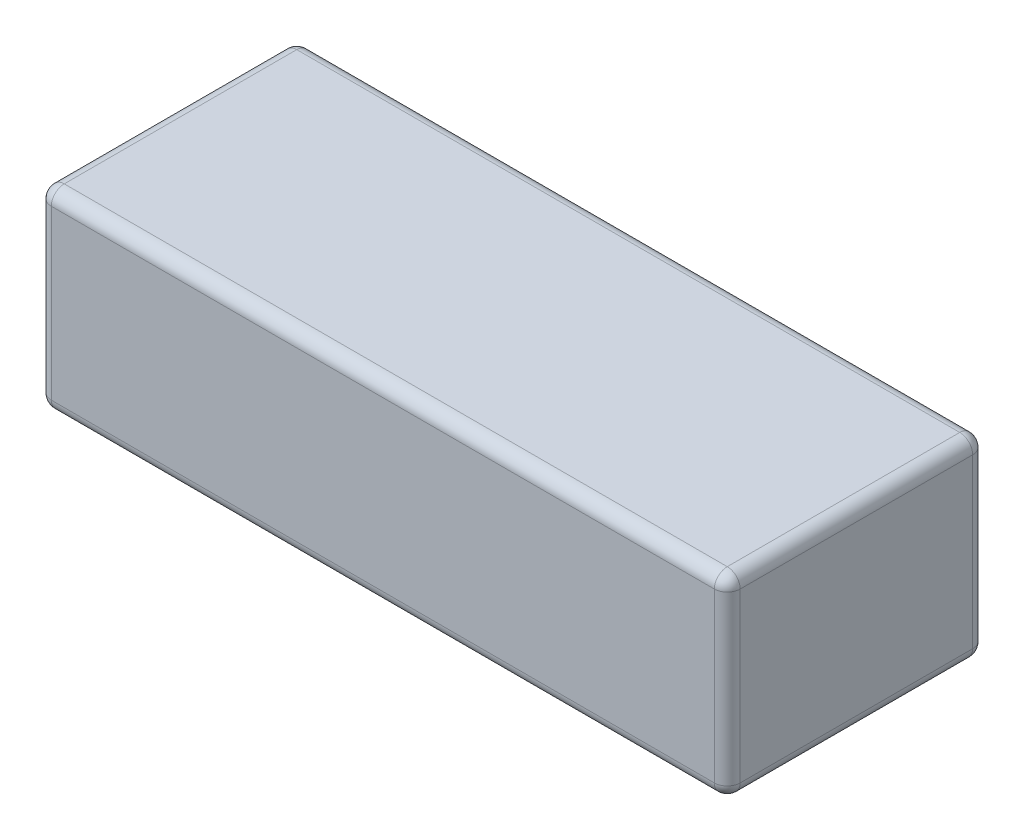
ISO-10303-21;
HEADER;
FILE_DESCRIPTION(('STEP AP214'),'2;1');
FILE_NAME('part.step','',(''),(''),'','','');
FILE_SCHEMA(('AUTOMOTIVE_DESIGN { 1 0 10303 214 1 1 1 1 }'));
ENDSEC;
DATA;
#1=APPLICATION_CONTEXT('core data for automotive mechanical design processes');
#2=APPLICATION_PROTOCOL_DEFINITION('international standard','automotive_design',2000,#1);
#3=PRODUCT_CONTEXT('',#1,'mechanical');
#4=PRODUCT('Part','Part','',(#3));
#5=PRODUCT_RELATED_PRODUCT_CATEGORY('part','',(#4));
#6=PRODUCT_DEFINITION_FORMATION('','',#4);
#7=PRODUCT_DEFINITION_CONTEXT('part definition',#1,'design');
#8=PRODUCT_DEFINITION('design','',#6,#7);
#9=PRODUCT_DEFINITION_SHAPE('','',#8);
#10=(LENGTH_UNIT() NAMED_UNIT(*) SI_UNIT(.MILLI.,.METRE.));
#11=(NAMED_UNIT(*) PLANE_ANGLE_UNIT() SI_UNIT($,.RADIAN.));
#12=(NAMED_UNIT(*) SI_UNIT($,.STERADIAN.) SOLID_ANGLE_UNIT());
#13=UNCERTAINTY_MEASURE_WITH_UNIT(LENGTH_MEASURE(1.E-05),#10,'distance_accuracy_value','');
#14=(GEOMETRIC_REPRESENTATION_CONTEXT(3) GLOBAL_UNCERTAINTY_ASSIGNED_CONTEXT((#13)) GLOBAL_UNIT_ASSIGNED_CONTEXT((#10,
#11,#12)) REPRESENTATION_CONTEXT('',''));
#15=CARTESIAN_POINT('',(0.,0.,0.));
#16=DIRECTION('',(0.,0.,1.));
#17=DIRECTION('',(1.,0.,0.));
#18=AXIS2_PLACEMENT_3D('',#15,#16,#17);
#19=CARTESIAN_POINT('',(0.,0.,60.));
#20=DIRECTION('',(1.,0.,0.));
#21=DIRECTION('',(0.,1.,0.));
#22=AXIS2_PLACEMENT_3D('',#19,#20,#21);
#23=PLANE('',#22);
#24=DIRECTION('',(0.,-1.,0.));
#25=VECTOR('',#24,1.);
#26=CARTESIAN_POINT('',(0.,0.,3.));
#27=LINE('',#26,#25);
#28=CARTESIAN_POINT('',(0.,-3.,3.));
#29=VERTEX_POINT('',#28);
#30=CARTESIAN_POINT('',(0.,-42.,3.));
#31=VERTEX_POINT('',#30);
#32=EDGE_CURVE('E286',#29,#31,#27,.T.);
#33=ORIENTED_EDGE('',*,*,#32,.T.);
#34=DIRECTION('',(0.,0.,-1.));
#35=VECTOR('',#34,1.);
#36=CARTESIAN_POINT('',(0.,-42.,60.));
#37=LINE('',#36,#35);
#38=CARTESIAN_POINT('',(0.,-42.,57.));
#39=VERTEX_POINT('',#38);
#40=EDGE_CURVE('E225',#31,#39,#37,.F.);
#41=ORIENTED_EDGE('',*,*,#40,.T.);
#42=DIRECTION('',(0.,-1.,0.));
#43=VECTOR('',#42,1.);
#44=CARTESIAN_POINT('',(0.,0.,57.));
#45=LINE('',#44,#43);
#46=CARTESIAN_POINT('',(0.,-3.,57.));
#47=VERTEX_POINT('',#46);
#48=EDGE_CURVE('E215',#39,#47,#45,.F.);
#49=ORIENTED_EDGE('',*,*,#48,.T.);
#50=DIRECTION('',(0.,0.,-1.));
#51=VECTOR('',#50,1.);
#52=CARTESIAN_POINT('',(0.,-3.,60.));
#53=LINE('',#52,#51);
#54=EDGE_CURVE('E283',#47,#29,#53,.T.);
#55=ORIENTED_EDGE('',*,*,#54,.T.);
#56=EDGE_LOOP('',(#33,#41,#49,#55));
#57=FACE_BOUND('',#56,.T.);
#58=ADVANCED_FACE('F38',(#57),#23,.F.);
#59=CARTESIAN_POINT('',(0.,-45.,60.));
#60=DIRECTION('',(0.,1.,0.));
#61=DIRECTION('',(0.,0.,1.));
#62=AXIS2_PLACEMENT_3D('',#59,#60,#61);
#63=PLANE('',#62);
#64=DIRECTION('',(1.,0.,0.));
#65=VECTOR('',#64,1.);
#66=CARTESIAN_POINT('',(0.,-45.,3.));
#67=LINE('',#66,#65);
#68=CARTESIAN_POINT('',(3.00000000000003,-45.,3.));
#69=VERTEX_POINT('',#68);
#70=CARTESIAN_POINT('',(157.,-45.,3.));
#71=VERTEX_POINT('',#70);
#72=EDGE_CURVE('E267',#69,#71,#67,.T.);
#73=ORIENTED_EDGE('',*,*,#72,.T.);
#74=DIRECTION('',(0.,0.,-1.));
#75=VECTOR('',#74,1.);
#76=CARTESIAN_POINT('',(157.,-45.,60.));
#77=LINE('',#76,#75);
#78=CARTESIAN_POINT('',(157.,-45.,57.));
#79=VERTEX_POINT('',#78);
#80=EDGE_CURVE('E264',#71,#79,#77,.F.);
#81=ORIENTED_EDGE('',*,*,#80,.T.);
#82=DIRECTION('',(1.,0.,0.));
#83=VECTOR('',#82,1.);
#84=CARTESIAN_POINT('',(0.,-45.,57.));
#85=LINE('',#84,#83);
#86=CARTESIAN_POINT('',(3.00000000000003,-45.,57.));
#87=VERTEX_POINT('',#86);
#88=EDGE_CURVE('E256',#79,#87,#85,.F.);
#89=ORIENTED_EDGE('',*,*,#88,.T.);
#90=DIRECTION('',(0.,0.,-1.));
#91=VECTOR('',#90,1.);
#92=CARTESIAN_POINT('',(3.00000000000003,-45.,60.));
#93=LINE('',#92,#91);
#94=EDGE_CURVE('E261',#87,#69,#93,.T.);
#95=ORIENTED_EDGE('',*,*,#94,.T.);
#96=EDGE_LOOP('',(#73,#81,#89,#95));
#97=FACE_BOUND('',#96,.T.);
#98=ADVANCED_FACE('F265',(#97),#63,.F.);
#99=CARTESIAN_POINT('',(160.,0.,60.));
#100=DIRECTION('',(-1.,0.,0.));
#101=DIRECTION('',(0.,0.,1.));
#102=AXIS2_PLACEMENT_3D('',#99,#100,#101);
#103=PLANE('',#102);
#104=DIRECTION('',(0.,1.,0.));
#105=VECTOR('',#104,1.);
#106=CARTESIAN_POINT('',(160.,-45.,57.));
#107=LINE('',#106,#105);
#108=CARTESIAN_POINT('',(160.,-3.,57.));
#109=VERTEX_POINT('',#108);
#110=CARTESIAN_POINT('',(160.,-42.,57.));
#111=VERTEX_POINT('',#110);
#112=EDGE_CURVE('E137',#109,#111,#107,.F.);
#113=ORIENTED_EDGE('',*,*,#112,.T.);
#114=DIRECTION('',(0.,0.,-1.));
#115=VECTOR('',#114,1.);
#116=CARTESIAN_POINT('',(160.,-42.,60.));
#117=LINE('',#116,#115);
#118=CARTESIAN_POINT('',(160.,-42.,3.));
#119=VERTEX_POINT('',#118);
#120=EDGE_CURVE('E133',#111,#119,#117,.T.);
#121=ORIENTED_EDGE('',*,*,#120,.T.);
#122=DIRECTION('',(0.,1.,0.));
#123=VECTOR('',#122,1.);
#124=CARTESIAN_POINT('',(160.,0.,3.));
#125=LINE('',#124,#123);
#126=CARTESIAN_POINT('',(160.,-3.,3.));
#127=VERTEX_POINT('',#126);
#128=EDGE_CURVE('E127',#119,#127,#125,.T.);
#129=ORIENTED_EDGE('',*,*,#128,.T.);
#130=DIRECTION('',(0.,0.,-1.));
#131=VECTOR('',#130,1.);
#132=CARTESIAN_POINT('',(160.,-3.,60.));
#133=LINE('',#132,#131);
#134=EDGE_CURVE('E130',#127,#109,#133,.F.);
#135=ORIENTED_EDGE('',*,*,#134,.T.);
#136=EDGE_LOOP('',(#113,#121,#129,#135));
#137=FACE_BOUND('',#136,.T.);
#138=ADVANCED_FACE('F129',(#137),#103,.F.);
#139=CARTESIAN_POINT('',(0.,0.,60.));
#140=DIRECTION('',(0.,-1.,0.));
#141=DIRECTION('',(0.,0.,-1.));
#142=AXIS2_PLACEMENT_3D('',#139,#140,#141);
#143=PLANE('',#142);
#144=DIRECTION('',(-1.,0.,0.));
#145=VECTOR('',#144,1.);
#146=CARTESIAN_POINT('',(160.,0.,57.));
#147=LINE('',#146,#145);
#148=CARTESIAN_POINT('',(3.,0.,57.));
#149=VERTEX_POINT('',#148);
#150=CARTESIAN_POINT('',(157.,0.,57.));
#151=VERTEX_POINT('',#150);
#152=EDGE_CURVE('E47',#149,#151,#147,.F.);
#153=ORIENTED_EDGE('',*,*,#152,.T.);
#154=DIRECTION('',(0.,0.,-1.));
#155=VECTOR('',#154,1.);
#156=CARTESIAN_POINT('',(157.,0.,60.));
#157=LINE('',#156,#155);
#158=CARTESIAN_POINT('',(157.,0.,3.));
#159=VERTEX_POINT('',#158);
#160=EDGE_CURVE('E11',#151,#159,#157,.T.);
#161=ORIENTED_EDGE('',*,*,#160,.T.);
#162=DIRECTION('',(-1.,0.,0.));
#163=VECTOR('',#162,1.);
#164=CARTESIAN_POINT('',(0.,0.,3.));
#165=LINE('',#164,#163);
#166=CARTESIAN_POINT('',(3.,0.,3.));
#167=VERTEX_POINT('',#166);
#168=EDGE_CURVE('E231',#159,#167,#165,.T.);
#169=ORIENTED_EDGE('',*,*,#168,.T.);
#170=DIRECTION('',(0.,0.,-1.));
#171=VECTOR('',#170,1.);
#172=CARTESIAN_POINT('',(3.,0.,60.));
#173=LINE('',#172,#171);
#174=EDGE_CURVE('E58',#167,#149,#173,.F.);
#175=ORIENTED_EDGE('',*,*,#174,.T.);
#176=EDGE_LOOP('',(#153,#161,#169,#175));
#177=FACE_BOUND('',#176,.T.);
#178=ADVANCED_FACE('F388',(#177),#143,.F.);
#179=CARTESIAN_POINT('',(0.,0.,60.));
#180=DIRECTION('',(0.,0.,1.));
#181=DIRECTION('',(1.,0.,0.));
#182=AXIS2_PLACEMENT_3D('',#179,#180,#181);
#183=PLANE('',#182);
#184=DIRECTION('',(1.,0.,0.));
#185=VECTOR('',#184,1.);
#186=CARTESIAN_POINT('',(160.,-42.,60.));
#187=LINE('',#186,#185);
#188=CARTESIAN_POINT('',(3.00000000000003,-42.,60.));
#189=VERTEX_POINT('',#188);
#190=CARTESIAN_POINT('',(157.,-42.,60.));
#191=VERTEX_POINT('',#190);
#192=EDGE_CURVE('E220',#189,#191,#187,.T.);
#193=ORIENTED_EDGE('',*,*,#192,.T.);
#194=DIRECTION('',(0.,1.,0.));
#195=VECTOR('',#194,1.);
#196=CARTESIAN_POINT('',(157.,0.,60.));
#197=LINE('',#196,#195);
#198=CARTESIAN_POINT('',(157.,-3.,60.));
#199=VERTEX_POINT('',#198);
#200=EDGE_CURVE('E223',#191,#199,#197,.T.);
#201=ORIENTED_EDGE('',*,*,#200,.T.);
#202=DIRECTION('',(-1.,0.,0.));
#203=VECTOR('',#202,1.);
#204=CARTESIAN_POINT('',(0.,-3.,60.));
#205=LINE('',#204,#203);
#206=CARTESIAN_POINT('',(3.,-3.,60.));
#207=VERTEX_POINT('',#206);
#208=EDGE_CURVE('E221',#199,#207,#205,.T.);
#209=ORIENTED_EDGE('',*,*,#208,.T.);
#210=DIRECTION('',(0.,-1.,0.));
#211=VECTOR('',#210,1.);
#212=CARTESIAN_POINT('',(3.00000000000003,-45.,60.));
#213=LINE('',#212,#211);
#214=EDGE_CURVE('E217',#207,#189,#213,.T.);
#215=ORIENTED_EDGE('',*,*,#214,.T.);
#216=EDGE_LOOP('',(#193,#201,#209,#215));
#217=FACE_BOUND('',#216,.T.);
#218=ADVANCED_FACE('F312',(#217),#183,.T.);
#219=CARTESIAN_POINT('',(0.,0.,0.));
#220=DIRECTION('',(0.,0.,1.));
#221=DIRECTION('',(1.,0.,0.));
#222=AXIS2_PLACEMENT_3D('',#219,#220,#221);
#223=PLANE('',#222);
#224=DIRECTION('',(0.,1.,0.));
#225=VECTOR('',#224,1.);
#226=CARTESIAN_POINT('',(157.,0.,0.));
#227=LINE('',#226,#225);
#228=CARTESIAN_POINT('',(157.,-3.,0.));
#229=VERTEX_POINT('',#228);
#230=CARTESIAN_POINT('',(157.,-42.,0.));
#231=VERTEX_POINT('',#230);
#232=EDGE_CURVE('E158',#229,#231,#227,.F.);
#233=ORIENTED_EDGE('',*,*,#232,.T.);
#234=DIRECTION('',(1.,0.,0.));
#235=VECTOR('',#234,1.);
#236=CARTESIAN_POINT('',(0.,-42.,0.));
#237=LINE('',#236,#235);
#238=CARTESIAN_POINT('',(3.00000000000003,-42.,0.));
#239=VERTEX_POINT('',#238);
#240=EDGE_CURVE('E280',#231,#239,#237,.F.);
#241=ORIENTED_EDGE('',*,*,#240,.T.);
#242=DIRECTION('',(0.,-1.,0.));
#243=VECTOR('',#242,1.);
#244=CARTESIAN_POINT('',(3.,0.,0.));
#245=LINE('',#244,#243);
#246=CARTESIAN_POINT('',(3.,-3.,0.));
#247=VERTEX_POINT('',#246);
#248=EDGE_CURVE('E273',#239,#247,#245,.F.);
#249=ORIENTED_EDGE('',*,*,#248,.T.);
#250=DIRECTION('',(-1.,0.,0.));
#251=VECTOR('',#250,1.);
#252=CARTESIAN_POINT('',(0.,-3.,0.));
#253=LINE('',#252,#251);
#254=EDGE_CURVE('E271',#247,#229,#253,.F.);
#255=ORIENTED_EDGE('',*,*,#254,.T.);
#256=EDGE_LOOP('',(#233,#241,#249,#255));
#257=FACE_BOUND('',#256,.T.);
#258=ADVANCED_FACE('F379',(#257),#223,.F.);
#259=CARTESIAN_POINT('',(3.,-3.,60.));
#260=DIRECTION('',(0.,0.,-1.));
#261=DIRECTION('',(-1.,0.,0.));
#262=AXIS2_PLACEMENT_3D('',#259,#260,#261);
#263=CYLINDRICAL_SURFACE('',#262,3.);
#264=CARTESIAN_POINT('',(3.,-3.,57.));
#265=DIRECTION('',(0.,0.,1.));
#266=DIRECTION('',(1.,0.,0.));
#267=AXIS2_PLACEMENT_3D('',#264,#265,#266);
#268=CIRCLE('',#267,3.);
#269=EDGE_CURVE('E42',#149,#47,#268,.T.);
#270=ORIENTED_EDGE('',*,*,#269,.F.);
#271=ORIENTED_EDGE('',*,*,#174,.F.);
#272=CARTESIAN_POINT('',(3.,-3.,3.));
#273=DIRECTION('',(0.,0.,-1.));
#274=DIRECTION('',(-1.,0.,0.));
#275=AXIS2_PLACEMENT_3D('',#272,#273,#274);
#276=CIRCLE('',#275,3.);
#277=EDGE_CURVE('E197',#29,#167,#276,.T.);
#278=ORIENTED_EDGE('',*,*,#277,.F.);
#279=ORIENTED_EDGE('',*,*,#54,.F.);
#280=EDGE_LOOP('',(#270,#271,#278,#279));
#281=FACE_BOUND('',#280,.T.);
#282=ADVANCED_FACE('F40',(#281),#263,.T.);
#283=CARTESIAN_POINT('',(3.,-3.,57.));
#284=DIRECTION('',(-1.,0.,0.));
#285=DIRECTION('',(0.,-1.,0.));
#286=AXIS2_PLACEMENT_3D('',#283,#284,#285);
#287=SPHERICAL_SURFACE('',#286,3.);
#288=CARTESIAN_POINT('',(3.,-3.,57.));
#289=DIRECTION('',(-1.,0.,0.));
#290=DIRECTION('',(0.,0.,1.));
#291=AXIS2_PLACEMENT_3D('',#288,#289,#290);
#292=CIRCLE('',#291,3.);
#293=EDGE_CURVE('E192',#149,#207,#292,.F.);
#294=ORIENTED_EDGE('',*,*,#293,.F.);
#295=ORIENTED_EDGE('',*,*,#269,.T.);
#296=CARTESIAN_POINT('',(3.,-3.,57.));
#297=DIRECTION('',(0.,1.,0.));
#298=DIRECTION('',(-1.,0.,0.));
#299=AXIS2_PLACEMENT_3D('',#296,#297,#298);
#300=CIRCLE('',#299,3.);
#301=EDGE_CURVE('E195',#207,#47,#300,.F.);
#302=ORIENTED_EDGE('',*,*,#301,.F.);
#303=EDGE_LOOP('',(#294,#295,#302));
#304=FACE_BOUND('',#303,.T.);
#305=ADVANCED_FACE('F207',(#304),#287,.T.);
#306=CARTESIAN_POINT('',(3.,-3.,3.));
#307=DIRECTION('',(0.,1.,0.));
#308=DIRECTION('',(0.,0.,1.));
#309=AXIS2_PLACEMENT_3D('',#306,#307,#308);
#310=SPHERICAL_SURFACE('',#309,3.);
#311=CARTESIAN_POINT('',(3.,-3.,3.));
#312=DIRECTION('',(0.,1.,0.));
#313=DIRECTION('',(-1.,0.,0.));
#314=AXIS2_PLACEMENT_3D('',#311,#312,#313);
#315=CIRCLE('',#314,3.);
#316=EDGE_CURVE('E186',#29,#247,#315,.F.);
#317=ORIENTED_EDGE('',*,*,#316,.F.);
#318=ORIENTED_EDGE('',*,*,#277,.T.);
#319=CARTESIAN_POINT('',(3.,-3.,3.));
#320=DIRECTION('',(-1.,0.,0.));
#321=DIRECTION('',(0.,0.,1.));
#322=AXIS2_PLACEMENT_3D('',#319,#320,#321);
#323=CIRCLE('',#322,3.);
#324=EDGE_CURVE('E189',#247,#167,#323,.F.);
#325=ORIENTED_EDGE('',*,*,#324,.F.);
#326=EDGE_LOOP('',(#317,#318,#325));
#327=FACE_BOUND('',#326,.T.);
#328=ADVANCED_FACE('F330',(#327),#310,.T.);
#329=CARTESIAN_POINT('',(3.,0.,57.));
#330=DIRECTION('',(0.,1.,0.));
#331=DIRECTION('',(-1.,0.,0.));
#332=AXIS2_PLACEMENT_3D('',#329,#330,#331);
#333=CYLINDRICAL_SURFACE('',#332,3.);
#334=ORIENTED_EDGE('',*,*,#301,.T.);
#335=ORIENTED_EDGE('',*,*,#48,.F.);
#336=CARTESIAN_POINT('',(3.00000000000003,-42.,57.));
#337=DIRECTION('',(0.,-1.,0.));
#338=DIRECTION('',(0.,0.,-1.));
#339=AXIS2_PLACEMENT_3D('',#336,#337,#338);
#340=CIRCLE('',#339,3.);
#341=EDGE_CURVE('E181',#189,#39,#340,.T.);
#342=ORIENTED_EDGE('',*,*,#341,.F.);
#343=ORIENTED_EDGE('',*,*,#214,.F.);
#344=EDGE_LOOP('',(#334,#335,#342,#343));
#345=FACE_BOUND('',#344,.T.);
#346=ADVANCED_FACE('F213',(#345),#333,.T.);
#347=CARTESIAN_POINT('',(0.,-3.,57.));
#348=DIRECTION('',(1.,0.,0.));
#349=DIRECTION('',(0.,0.,-1.));
#350=AXIS2_PLACEMENT_3D('',#347,#348,#349);
#351=CYLINDRICAL_SURFACE('',#350,3.);
#352=ORIENTED_EDGE('',*,*,#293,.T.);
#353=ORIENTED_EDGE('',*,*,#208,.F.);
#354=CARTESIAN_POINT('',(157.,-3.,57.));
#355=DIRECTION('',(1.,0.,0.));
#356=DIRECTION('',(0.,0.,-1.));
#357=AXIS2_PLACEMENT_3D('',#354,#355,#356);
#358=CIRCLE('',#357,3.);
#359=EDGE_CURVE('E178',#151,#199,#358,.T.);
#360=ORIENTED_EDGE('',*,*,#359,.F.);
#361=ORIENTED_EDGE('',*,*,#152,.F.);
#362=EDGE_LOOP('',(#352,#353,#360,#361));
#363=FACE_BOUND('',#362,.T.);
#364=ADVANCED_FACE('F321',(#363),#351,.T.);
#365=CARTESIAN_POINT('',(157.,-3.,60.));
#366=DIRECTION('',(0.,0.,-1.));
#367=DIRECTION('',(-1.,0.,0.));
#368=AXIS2_PLACEMENT_3D('',#365,#366,#367);
#369=CYLINDRICAL_SURFACE('',#368,3.);
#370=CARTESIAN_POINT('',(157.,-3.,3.));
#371=DIRECTION('',(0.,0.,-1.));
#372=DIRECTION('',(-1.,0.,0.));
#373=AXIS2_PLACEMENT_3D('',#370,#371,#372);
#374=CIRCLE('',#373,3.);
#375=EDGE_CURVE('E143',#159,#127,#374,.T.);
#376=ORIENTED_EDGE('',*,*,#375,.F.);
#377=ORIENTED_EDGE('',*,*,#160,.F.);
#378=CARTESIAN_POINT('',(157.,-3.,57.));
#379=DIRECTION('',(0.,0.,1.));
#380=DIRECTION('',(1.,0.,0.));
#381=AXIS2_PLACEMENT_3D('',#378,#379,#380);
#382=CIRCLE('',#381,3.);
#383=EDGE_CURVE('E146',#109,#151,#382,.T.);
#384=ORIENTED_EDGE('',*,*,#383,.F.);
#385=ORIENTED_EDGE('',*,*,#134,.F.);
#386=EDGE_LOOP('',(#376,#377,#384,#385));
#387=FACE_BOUND('',#386,.T.);
#388=ADVANCED_FACE('F142',(#387),#369,.T.);
#389=CARTESIAN_POINT('',(0.,-3.,3.));
#390=DIRECTION('',(-1.,0.,0.));
#391=DIRECTION('',(0.,0.,1.));
#392=AXIS2_PLACEMENT_3D('',#389,#390,#391);
#393=CYLINDRICAL_SURFACE('',#392,3.);
#394=ORIENTED_EDGE('',*,*,#324,.T.);
#395=ORIENTED_EDGE('',*,*,#168,.F.);
#396=CARTESIAN_POINT('',(157.,-3.,3.));
#397=DIRECTION('',(1.,0.,0.));
#398=DIRECTION('',(0.,0.,-1.));
#399=AXIS2_PLACEMENT_3D('',#396,#397,#398);
#400=CIRCLE('',#399,3.);
#401=EDGE_CURVE('E155',#229,#159,#400,.T.);
#402=ORIENTED_EDGE('',*,*,#401,.F.);
#403=ORIENTED_EDGE('',*,*,#254,.F.);
#404=EDGE_LOOP('',(#394,#395,#402,#403));
#405=FACE_BOUND('',#404,.T.);
#406=ADVANCED_FACE('F328',(#405),#393,.T.);
#407=CARTESIAN_POINT('',(3.,0.,3.));
#408=DIRECTION('',(0.,-1.,0.));
#409=DIRECTION('',(1.,0.,0.));
#410=AXIS2_PLACEMENT_3D('',#407,#408,#409);
#411=CYLINDRICAL_SURFACE('',#410,3.);
#412=ORIENTED_EDGE('',*,*,#316,.T.);
#413=ORIENTED_EDGE('',*,*,#248,.F.);
#414=CARTESIAN_POINT('',(3.00000000000003,-42.,3.));
#415=DIRECTION('',(0.,-1.,0.));
#416=DIRECTION('',(0.,0.,-1.));
#417=AXIS2_PLACEMENT_3D('',#414,#415,#416);
#418=CIRCLE('',#417,3.);
#419=EDGE_CURVE('E173',#31,#239,#418,.T.);
#420=ORIENTED_EDGE('',*,*,#419,.F.);
#421=ORIENTED_EDGE('',*,*,#32,.F.);
#422=EDGE_LOOP('',(#412,#413,#420,#421));
#423=FACE_BOUND('',#422,.T.);
#424=ADVANCED_FACE('F298',(#423),#411,.T.);
#425=CARTESIAN_POINT('',(3.00000000000003,-42.,60.));
#426=DIRECTION('',(0.,0.,-1.));
#427=DIRECTION('',(-1.,0.,0.));
#428=AXIS2_PLACEMENT_3D('',#425,#426,#427);
#429=CYLINDRICAL_SURFACE('',#428,3.);
#430=CARTESIAN_POINT('',(3.00000000000003,-42.,57.));
#431=DIRECTION('',(0.,0.,1.));
#432=DIRECTION('',(1.,0.,0.));
#433=AXIS2_PLACEMENT_3D('',#430,#431,#432);
#434=CIRCLE('',#433,3.);
#435=EDGE_CURVE('E183',#39,#87,#434,.T.);
#436=ORIENTED_EDGE('',*,*,#435,.F.);
#437=ORIENTED_EDGE('',*,*,#40,.F.);
#438=CARTESIAN_POINT('',(3.00000000000003,-42.,3.));
#439=DIRECTION('',(0.,0.,-1.));
#440=DIRECTION('',(-1.,0.,0.));
#441=AXIS2_PLACEMENT_3D('',#438,#439,#440);
#442=CIRCLE('',#441,3.);
#443=EDGE_CURVE('E170',#69,#31,#442,.T.);
#444=ORIENTED_EDGE('',*,*,#443,.F.);
#445=ORIENTED_EDGE('',*,*,#94,.F.);
#446=EDGE_LOOP('',(#436,#437,#444,#445));
#447=FACE_BOUND('',#446,.T.);
#448=ADVANCED_FACE('F294',(#447),#429,.T.);
#449=CARTESIAN_POINT('',(3.00000000000003,-42.,57.));
#450=DIRECTION('',(-1.,0.,0.));
#451=DIRECTION('',(0.,0.,1.));
#452=AXIS2_PLACEMENT_3D('',#449,#450,#451);
#453=SPHERICAL_SURFACE('',#452,3.);
#454=ORIENTED_EDGE('',*,*,#341,.T.);
#455=ORIENTED_EDGE('',*,*,#435,.T.);
#456=CARTESIAN_POINT('',(3.00000000000003,-42.,57.));
#457=DIRECTION('',(-1.,0.,0.));
#458=DIRECTION('',(0.,0.,1.));
#459=AXIS2_PLACEMENT_3D('',#456,#457,#458);
#460=CIRCLE('',#459,3.);
#461=EDGE_CURVE('E162',#189,#87,#460,.F.);
#462=ORIENTED_EDGE('',*,*,#461,.F.);
#463=EDGE_LOOP('',(#454,#455,#462));
#464=FACE_BOUND('',#463,.T.);
#465=ADVANCED_FACE('F310',(#464),#453,.T.);
#466=CARTESIAN_POINT('',(157.,-3.,57.));
#467=DIRECTION('',(0.,1.,0.));
#468=DIRECTION('',(0.,0.,1.));
#469=AXIS2_PLACEMENT_3D('',#466,#467,#468);
#470=SPHERICAL_SURFACE('',#469,3.);
#471=ORIENTED_EDGE('',*,*,#383,.T.);
#472=ORIENTED_EDGE('',*,*,#359,.T.);
#473=CARTESIAN_POINT('',(157.,-3.,57.));
#474=DIRECTION('',(0.,1.,0.));
#475=DIRECTION('',(0.,0.,1.));
#476=AXIS2_PLACEMENT_3D('',#473,#474,#475);
#477=CIRCLE('',#476,3.);
#478=EDGE_CURVE('E159',#109,#199,#477,.F.);
#479=ORIENTED_EDGE('',*,*,#478,.F.);
#480=EDGE_LOOP('',(#471,#472,#479));
#481=FACE_BOUND('',#480,.T.);
#482=ADVANCED_FACE('F319',(#481),#470,.T.);
#483=CARTESIAN_POINT('',(157.,-3.,3.));
#484=DIRECTION('',(0.,1.,0.));
#485=DIRECTION('',(0.,0.,1.));
#486=AXIS2_PLACEMENT_3D('',#483,#484,#485);
#487=SPHERICAL_SURFACE('',#486,3.);
#488=ORIENTED_EDGE('',*,*,#401,.T.);
#489=ORIENTED_EDGE('',*,*,#375,.T.);
#490=CARTESIAN_POINT('',(157.,-3.,3.));
#491=DIRECTION('',(0.,1.,0.));
#492=DIRECTION('',(0.,0.,1.));
#493=AXIS2_PLACEMENT_3D('',#490,#491,#492);
#494=CIRCLE('',#493,3.);
#495=EDGE_CURVE('E152',#229,#127,#494,.F.);
#496=ORIENTED_EDGE('',*,*,#495,.F.);
#497=EDGE_LOOP('',(#488,#489,#496));
#498=FACE_BOUND('',#497,.T.);
#499=ADVANCED_FACE('F151',(#498),#487,.T.);
#500=CARTESIAN_POINT('',(3.00000000000003,-42.,3.));
#501=DIRECTION('',(-1.,0.,0.));
#502=DIRECTION('',(0.,0.,1.));
#503=AXIS2_PLACEMENT_3D('',#500,#501,#502);
#504=SPHERICAL_SURFACE('',#503,3.);
#505=ORIENTED_EDGE('',*,*,#443,.T.);
#506=ORIENTED_EDGE('',*,*,#419,.T.);
#507=CARTESIAN_POINT('',(3.00000000000003,-42.,3.));
#508=DIRECTION('',(-1.,0.,0.));
#509=DIRECTION('',(0.,0.,1.));
#510=AXIS2_PLACEMENT_3D('',#507,#508,#509);
#511=CIRCLE('',#510,3.);
#512=EDGE_CURVE('E160',#69,#239,#511,.F.);
#513=ORIENTED_EDGE('',*,*,#512,.F.);
#514=EDGE_LOOP('',(#505,#506,#513));
#515=FACE_BOUND('',#514,.T.);
#516=ADVANCED_FACE('F300',(#515),#504,.T.);
#517=CARTESIAN_POINT('',(0.,-42.,57.));
#518=DIRECTION('',(-1.,0.,0.));
#519=DIRECTION('',(0.,0.,1.));
#520=AXIS2_PLACEMENT_3D('',#517,#518,#519);
#521=CYLINDRICAL_SURFACE('',#520,3.);
#522=ORIENTED_EDGE('',*,*,#461,.T.);
#523=ORIENTED_EDGE('',*,*,#88,.F.);
#524=CARTESIAN_POINT('',(157.,-42.,57.));
#525=DIRECTION('',(1.,0.,0.));
#526=DIRECTION('',(0.,0.,-1.));
#527=AXIS2_PLACEMENT_3D('',#524,#525,#526);
#528=CIRCLE('',#527,3.);
#529=EDGE_CURVE('E164',#191,#79,#528,.T.);
#530=ORIENTED_EDGE('',*,*,#529,.F.);
#531=ORIENTED_EDGE('',*,*,#192,.F.);
#532=EDGE_LOOP('',(#522,#523,#530,#531));
#533=FACE_BOUND('',#532,.T.);
#534=ADVANCED_FACE('F258',(#533),#521,.T.);
#535=CARTESIAN_POINT('',(157.,0.,57.));
#536=DIRECTION('',(0.,-1.,0.));
#537=DIRECTION('',(0.,0.,-1.));
#538=AXIS2_PLACEMENT_3D('',#535,#536,#537);
#539=CYLINDRICAL_SURFACE('',#538,3.);
#540=ORIENTED_EDGE('',*,*,#478,.T.);
#541=ORIENTED_EDGE('',*,*,#200,.F.);
#542=CARTESIAN_POINT('',(157.,-42.,57.));
#543=DIRECTION('',(0.,-1.,0.));
#544=DIRECTION('',(0.,0.,-1.));
#545=AXIS2_PLACEMENT_3D('',#542,#543,#544);
#546=CIRCLE('',#545,3.);
#547=EDGE_CURVE('E245',#111,#191,#546,.T.);
#548=ORIENTED_EDGE('',*,*,#547,.F.);
#549=ORIENTED_EDGE('',*,*,#112,.F.);
#550=EDGE_LOOP('',(#540,#541,#548,#549));
#551=FACE_BOUND('',#550,.T.);
#552=ADVANCED_FACE('F314',(#551),#539,.T.);
#553=CARTESIAN_POINT('',(157.,0.,3.));
#554=DIRECTION('',(0.,1.,0.));
#555=DIRECTION('',(0.,0.,1.));
#556=AXIS2_PLACEMENT_3D('',#553,#554,#555);
#557=CYLINDRICAL_SURFACE('',#556,3.);
#558=ORIENTED_EDGE('',*,*,#495,.T.);
#559=ORIENTED_EDGE('',*,*,#128,.F.);
#560=CARTESIAN_POINT('',(157.,-42.,3.));
#561=DIRECTION('',(0.,-1.,0.));
#562=DIRECTION('',(0.,0.,-1.));
#563=AXIS2_PLACEMENT_3D('',#560,#561,#562);
#564=CIRCLE('',#563,3.);
#565=EDGE_CURVE('E242',#231,#119,#564,.T.);
#566=ORIENTED_EDGE('',*,*,#565,.F.);
#567=ORIENTED_EDGE('',*,*,#232,.F.);
#568=EDGE_LOOP('',(#558,#559,#566,#567));
#569=FACE_BOUND('',#568,.T.);
#570=ADVANCED_FACE('F157',(#569),#557,.T.);
#571=CARTESIAN_POINT('',(0.,-42.,3.));
#572=DIRECTION('',(1.,0.,0.));
#573=DIRECTION('',(0.,0.,-1.));
#574=AXIS2_PLACEMENT_3D('',#571,#572,#573);
#575=CYLINDRICAL_SURFACE('',#574,3.);
#576=ORIENTED_EDGE('',*,*,#512,.T.);
#577=ORIENTED_EDGE('',*,*,#240,.F.);
#578=CARTESIAN_POINT('',(157.,-42.,3.));
#579=DIRECTION('',(1.,0.,0.));
#580=DIRECTION('',(0.,0.,-1.));
#581=AXIS2_PLACEMENT_3D('',#578,#579,#580);
#582=CIRCLE('',#581,3.);
#583=EDGE_CURVE('E239',#71,#231,#582,.T.);
#584=ORIENTED_EDGE('',*,*,#583,.F.);
#585=ORIENTED_EDGE('',*,*,#72,.F.);
#586=EDGE_LOOP('',(#576,#577,#584,#585));
#587=FACE_BOUND('',#586,.T.);
#588=ADVANCED_FACE('F303',(#587),#575,.T.);
#589=CARTESIAN_POINT('',(157.,-42.,57.));
#590=DIRECTION('',(0.,0.,1.));
#591=DIRECTION('',(1.,0.,0.));
#592=AXIS2_PLACEMENT_3D('',#589,#590,#591);
#593=SPHERICAL_SURFACE('',#592,3.);
#594=ORIENTED_EDGE('',*,*,#547,.T.);
#595=ORIENTED_EDGE('',*,*,#529,.T.);
#596=CARTESIAN_POINT('',(157.,-42.,57.));
#597=DIRECTION('',(0.,0.,1.));
#598=DIRECTION('',(1.,0.,0.));
#599=AXIS2_PLACEMENT_3D('',#596,#597,#598);
#600=CIRCLE('',#599,3.);
#601=EDGE_CURVE('E237',#111,#79,#600,.F.);
#602=ORIENTED_EDGE('',*,*,#601,.F.);
#603=EDGE_LOOP('',(#594,#595,#602));
#604=FACE_BOUND('',#603,.T.);
#605=ADVANCED_FACE('F252',(#604),#593,.T.);
#606=CARTESIAN_POINT('',(157.,-42.,3.));
#607=DIRECTION('',(0.,0.,-1.));
#608=DIRECTION('',(-1.,0.,0.));
#609=AXIS2_PLACEMENT_3D('',#606,#607,#608);
#610=SPHERICAL_SURFACE('',#609,3.);
#611=ORIENTED_EDGE('',*,*,#583,.T.);
#612=ORIENTED_EDGE('',*,*,#565,.T.);
#613=CARTESIAN_POINT('',(157.,-42.,3.));
#614=DIRECTION('',(0.,0.,-1.));
#615=DIRECTION('',(-1.,0.,0.));
#616=AXIS2_PLACEMENT_3D('',#613,#614,#615);
#617=CIRCLE('',#616,3.);
#618=EDGE_CURVE('E235',#71,#119,#617,.F.);
#619=ORIENTED_EDGE('',*,*,#618,.F.);
#620=EDGE_LOOP('',(#611,#612,#619));
#621=FACE_BOUND('',#620,.T.);
#622=ADVANCED_FACE('F305',(#621),#610,.T.);
#623=CARTESIAN_POINT('',(157.,-42.,60.));
#624=DIRECTION('',(0.,0.,-1.));
#625=DIRECTION('',(-1.,0.,0.));
#626=AXIS2_PLACEMENT_3D('',#623,#624,#625);
#627=CYLINDRICAL_SURFACE('',#626,3.);
#628=ORIENTED_EDGE('',*,*,#601,.T.);
#629=ORIENTED_EDGE('',*,*,#80,.F.);
#630=ORIENTED_EDGE('',*,*,#618,.T.);
#631=ORIENTED_EDGE('',*,*,#120,.F.);
#632=EDGE_LOOP('',(#628,#629,#630,#631));
#633=FACE_BOUND('',#632,.T.);
#634=ADVANCED_FACE('F306',(#633),#627,.T.);
#635=CLOSED_SHELL('',(#58,#98,#138,#178,#218,#258,#282,#305,#328,#346,#364,#388,#406,#424,#448,
#465,#482,#499,#516,#534,#552,#570,#588,#605,#622,#634));
#636=MANIFOLD_SOLID_BREP('B2',#635);
#637=ADVANCED_BREP_SHAPE_REPRESENTATION('',(#18,#636),#14);
#638=SHAPE_DEFINITION_REPRESENTATION(#9,#637);
ENDSEC;
END-ISO-10303-21;
